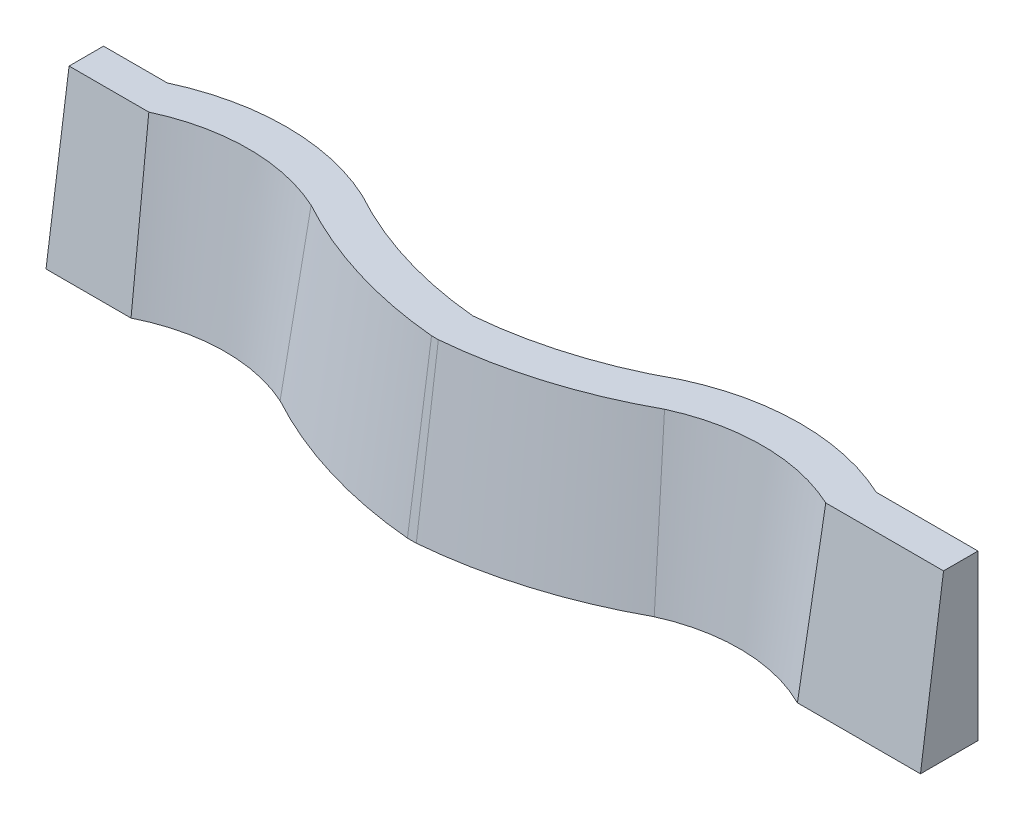
ISO-10303-21;
HEADER;
FILE_DESCRIPTION(('STEP AP214'),'2;1');
FILE_NAME('part.step','',(''),(''),'','','');
FILE_SCHEMA(('AUTOMOTIVE_DESIGN { 1 0 10303 214 1 1 1 1 }'));
ENDSEC;
DATA;
#1=APPLICATION_CONTEXT('core data for automotive mechanical design processes');
#2=APPLICATION_PROTOCOL_DEFINITION('international standard','automotive_design',2000,#1);
#3=PRODUCT_CONTEXT('',#1,'mechanical');
#4=PRODUCT('Part','Part','',(#3));
#5=PRODUCT_RELATED_PRODUCT_CATEGORY('part','',(#4));
#6=PRODUCT_DEFINITION_FORMATION('','',#4);
#7=PRODUCT_DEFINITION_CONTEXT('part definition',#1,'design');
#8=PRODUCT_DEFINITION('design','',#6,#7);
#9=PRODUCT_DEFINITION_SHAPE('','',#8);
#10=(LENGTH_UNIT() NAMED_UNIT(*) SI_UNIT(.MILLI.,.METRE.));
#11=(NAMED_UNIT(*) PLANE_ANGLE_UNIT() SI_UNIT($,.RADIAN.));
#12=(NAMED_UNIT(*) SI_UNIT($,.STERADIAN.) SOLID_ANGLE_UNIT());
#13=UNCERTAINTY_MEASURE_WITH_UNIT(LENGTH_MEASURE(1.E-05),#10,'distance_accuracy_value','');
#14=(GEOMETRIC_REPRESENTATION_CONTEXT(3) GLOBAL_UNCERTAINTY_ASSIGNED_CONTEXT((#13)) GLOBAL_UNIT_ASSIGNED_CONTEXT((#10,
#11,#12)) REPRESENTATION_CONTEXT('',''));
#15=CARTESIAN_POINT('',(0.,0.,0.));
#16=DIRECTION('',(0.,0.,1.));
#17=DIRECTION('',(1.,0.,0.));
#18=AXIS2_PLACEMENT_3D('',#15,#16,#17);
#19=CARTESIAN_POINT('',(67.6062576231202,24.,85.029602130527));
#20=DIRECTION('',(0.,1.,0.));
#21=DIRECTION('',(0.,0.,1.));
#22=AXIS2_PLACEMENT_3D('',#19,#20,#21);
#23=CONICAL_SURFACE('',#22,50.7112727072649,0.139626340159547);
#24=CARTESIAN_POINT('',(49.2028558847586,-19.2,44.3597576684553));
#25=CARTESIAN_POINT('',(48.7507512793166,-12.000003677897,43.453668951004));
#26=CARTESIAN_POINT('',(48.2979035620886,-4.80000551501564,42.5479671954122));
#27=CARTESIAN_POINT('',(47.3907219045216,9.59999448498437,40.7373376088675));
#28=CARTESIAN_POINT('',(46.9363879641841,16.799996322103,39.8324097779139));
#29=CARTESIAN_POINT('',(46.4813109120621,24.,38.927868908819));
#30=B_SPLINE_CURVE_WITH_KNOTS('',3,(#24,#25,#26,#27,#28,#29),.UNSPECIFIED.,.F.,.F.,(4,2,4),(0.,
21.8125666173238,43.6251332124724),.UNSPECIFIED.);
#31=CARTESIAN_POINT('',(49.2028558847586,-19.2,44.3597576684553));
#32=VERTEX_POINT('',#31);
#33=CARTESIAN_POINT('',(46.4813109120623,24.,38.9278689088189));
#34=VERTEX_POINT('',#33);
#35=EDGE_CURVE('E94',#32,#34,#30,.T.);
#36=ORIENTED_EDGE('',*,*,#35,.F.);
#37=CARTESIAN_POINT('',(67.6062576231202,-19.2,85.029602130527));
#38=DIRECTION('',(0.,1.,0.));
#39=DIRECTION('',(0.,0.,1.));
#40=AXIS2_PLACEMENT_3D('',#37,#38,#39);
#41=CIRCLE('',#40,44.6399086481215);
#42=CARTESIAN_POINT('',(87.6358133003991,-19.2,45.1355130510227));
#43=VERTEX_POINT('',#42);
#44=EDGE_CURVE('E51',#32,#43,#41,.F.);
#45=ORIENTED_EDGE('',*,*,#44,.T.);
#46=CARTESIAN_POINT('',(87.6358133003991,-19.2,45.1355130510227));
#47=CARTESIAN_POINT('',(87.7556869922726,-15.6001275997856,44.6295839790745));
#48=CARTESIAN_POINT('',(87.8744888307975,-12.0002202606094,44.1236499967754));
#49=CARTESIAN_POINT('',(88.1100523832755,-4.80034114464104,43.1117729760609));
#50=CARTESIAN_POINT('',(88.2268140978103,-1.20036936786753,42.6058299376481));
#51=CARTESIAN_POINT('',(88.4584010476308,5.99963507905401,41.5939353028168));
#52=CARTESIAN_POINT('',(88.5732262830007,9.59966774919941,41.0879837063987));
#53=CARTESIAN_POINT('',(88.8010316894868,16.7997913698,40.0760723227991));
#54=CARTESIAN_POINT('',(88.9140118600771,20.3998823202715,39.5701125356153));
#55=CARTESIAN_POINT('',(89.0261151704845,24.,39.0641489918794));
#56=B_SPLINE_CURVE_WITH_KNOTS('',3,(#46,#47,#48,#49,#50,#51,#52,#53,#54,#55),.UNSPECIFIED.,.F.,
.F.,(4,2,2,2,4),(0.,10.9116786800797,21.8233542494796,32.7350293447434,43.6467075502935),.UNSPECIFIED.);
#57=CARTESIAN_POINT('',(89.0261151704844,24.,39.0641489918794));
#58=VERTEX_POINT('',#57);
#59=EDGE_CURVE('E124',#43,#58,#56,.T.);
#60=ORIENTED_EDGE('',*,*,#59,.T.);
#61=CARTESIAN_POINT('',(67.6062576231202,24.,85.029602130527));
#62=DIRECTION('',(0.,1.,0.));
#63=DIRECTION('',(0.,0.,1.));
#64=AXIS2_PLACEMENT_3D('',#61,#62,#63);
#65=CIRCLE('',#64,50.7112727072649);
#66=EDGE_CURVE('E99',#58,#34,#65,.T.);
#67=ORIENTED_EDGE('',*,*,#66,.T.);
#68=EDGE_LOOP('',(#36,#45,#60,#67));
#69=FACE_BOUND('',#68,.T.);
#70=ADVANCED_FACE('F41',(#69),#23,.F.);
#71=CARTESIAN_POINT('',(-9.52483016864245,24.,-62.9793470940987));
#72=DIRECTION('',(0.,-1.,0.));
#73=DIRECTION('',(0.,0.,1.));
#74=AXIS2_PLACEMENT_3D('',#71,#72,#73);
#75=CONICAL_SURFACE('',#74,116.283139415038,0.139626340159547);
#76=CARTESIAN_POINT('',(-9.52483016864245,-19.2,-62.9793470940987));
#77=DIRECTION('',(0.,1.,0.));
#78=DIRECTION('',(0.,0.,1.));
#79=AXIS2_PLACEMENT_3D('',#76,#77,#78);
#80=CIRCLE('',#79,122.354503474181);
#81=CARTESIAN_POINT('',(1.16529870736144,-19.2,58.9072627735476));
#82=VERTEX_POINT('',#81);
#83=EDGE_CURVE('E46',#32,#82,#80,.F.);
#84=ORIENTED_EDGE('',*,*,#83,.F.);
#85=ORIENTED_EDGE('',*,*,#35,.T.);
#86=CARTESIAN_POINT('',(-9.52483016864245,24.,-62.9793470940987));
#87=DIRECTION('',(0.,1.,0.));
#88=DIRECTION('',(0.,0.,1.));
#89=AXIS2_PLACEMENT_3D('',#86,#87,#88);
#90=CIRCLE('',#89,116.283139415038);
#91=CARTESIAN_POINT('',(0.896175086760287,24.,52.8358987144043));
#92=VERTEX_POINT('',#91);
#93=EDGE_CURVE('E185',#92,#34,#90,.T.);
#94=ORIENTED_EDGE('',*,*,#93,.F.);
#95=CARTESIAN_POINT('',(1.16529870736144,-19.2,58.9072627735476));
#96=CARTESIAN_POINT('',(1.12101652122196,-11.9999965074305,57.8953682728418));
#97=CARTESIAN_POINT('',(1.07644845976969,-4.79999476128738,56.8834740175801));
#98=CARTESIAN_POINT('',(0.986740586236059,9.60000523871262,54.8596859978657));
#99=CARTESIAN_POINT('',(0.941600774154646,16.8000034925695,53.8477922334129));
#100=CARTESIAN_POINT('',(0.896175086760401,24.,52.8358987144043));
#101=B_SPLINE_CURVE_WITH_KNOTS('',3,(#95,#96,#97,#98,#99,#100),.UNSPECIFIED.,.F.,.F.,(4,2,4),
(0.,21.8126906401658,43.6253812820475),.UNSPECIFIED.);
#102=EDGE_CURVE('E96',#82,#92,#101,.T.);
#103=ORIENTED_EDGE('',*,*,#102,.F.);
#104=EDGE_LOOP('',(#84,#85,#94,#103));
#105=FACE_BOUND('',#104,.T.);
#106=ADVANCED_FACE('F91',(#105),#75,.T.);
#107=CARTESIAN_POINT('',(0.,24.,52.8358987144043));
#108=DIRECTION('',(0.,0.139173100960066,0.99026806874157));
#109=DIRECTION('',(0.,0.99026806874157,-0.139173100960066));
#110=AXIS2_PLACEMENT_3D('',#107,#108,#109);
#111=PLANE('',#110);
#112=DIRECTION('',(-1.,0.,0.));
#113=VECTOR('',#112,1.);
#114=CARTESIAN_POINT('',(0.,-19.2,58.9072627735476));
#115=LINE('',#114,#113);
#116=CARTESIAN_POINT('',(-1.16529870736128,-19.2,58.9072627735476));
#117=VERTEX_POINT('',#116);
#118=EDGE_CURVE('E65',#82,#117,#115,.T.);
#119=ORIENTED_EDGE('',*,*,#118,.F.);
#120=ORIENTED_EDGE('',*,*,#102,.T.);
#121=DIRECTION('',(1.,0.,0.));
#122=VECTOR('',#121,1.);
#123=CARTESIAN_POINT('',(0.,24.,52.8358987144043));
#124=LINE('',#123,#122);
#125=CARTESIAN_POINT('',(-0.896175086760287,24.,52.8358987144043));
#126=VERTEX_POINT('',#125);
#127=EDGE_CURVE('E183',#126,#92,#124,.T.);
#128=ORIENTED_EDGE('',*,*,#127,.F.);
#129=CARTESIAN_POINT('',(-1.16529870736128,-19.2,58.9072627735476));
#130=CARTESIAN_POINT('',(-1.12101652122172,-11.9999965074305,57.8953682728418));
#131=CARTESIAN_POINT('',(-1.07644845976942,-4.79999476128738,56.8834740175801));
#132=CARTESIAN_POINT('',(-0.986740586235836,9.60000523871261,54.8596859978657));
#133=CARTESIAN_POINT('',(-0.941600774154501,16.8000034925695,53.8477922334129));
#134=CARTESIAN_POINT('',(-0.896175086760387,24.,52.8358987144043));
#135=B_SPLINE_CURVE_WITH_KNOTS('',3,(#129,#130,#131,#132,#133,#134),.UNSPECIFIED.,.F.,.F.,(4,2,
4),(0.,21.8126906401658,43.6253812820475),.UNSPECIFIED.);
#136=EDGE_CURVE('E110',#117,#126,#135,.T.);
#137=ORIENTED_EDGE('',*,*,#136,.F.);
#138=EDGE_LOOP('',(#119,#120,#128,#137));
#139=FACE_BOUND('',#138,.T.);
#140=ADVANCED_FACE('F214',(#139),#111,.T.);
#141=CARTESIAN_POINT('',(9.52483016864245,24.,-62.9793470940987));
#142=DIRECTION('',(0.,-1.,0.));
#143=DIRECTION('',(0.,0.,1.));
#144=AXIS2_PLACEMENT_3D('',#141,#142,#143);
#145=CONICAL_SURFACE('',#144,116.283139415038,0.139626340159547);
#146=CARTESIAN_POINT('',(9.52483016864245,-19.2,-62.9793470940987));
#147=DIRECTION('',(0.,1.,0.));
#148=DIRECTION('',(0.,0.,1.));
#149=AXIS2_PLACEMENT_3D('',#146,#147,#148);
#150=CIRCLE('',#149,122.354503474181);
#151=CARTESIAN_POINT('',(-49.2028558847585,-19.2,44.3597576684554));
#152=VERTEX_POINT('',#151);
#153=EDGE_CURVE('E162',#117,#152,#150,.F.);
#154=ORIENTED_EDGE('',*,*,#153,.F.);
#155=ORIENTED_EDGE('',*,*,#136,.T.);
#156=CARTESIAN_POINT('',(9.52483016864245,24.,-62.9793470940987));
#157=DIRECTION('',(0.,1.,0.));
#158=DIRECTION('',(0.,0.,1.));
#159=AXIS2_PLACEMENT_3D('',#156,#157,#158);
#160=CIRCLE('',#159,116.283139415038);
#161=CARTESIAN_POINT('',(-46.4813109120622,24.,38.9278689088189));
#162=VERTEX_POINT('',#161);
#163=EDGE_CURVE('E189',#162,#126,#160,.T.);
#164=ORIENTED_EDGE('',*,*,#163,.F.);
#165=CARTESIAN_POINT('',(-49.2028558847585,-19.2,44.3597576684554));
#166=CARTESIAN_POINT('',(-48.7507512793166,-12.000003677897,43.453668951004));
#167=CARTESIAN_POINT('',(-48.2979035620886,-4.80000551501565,42.5479671954121));
#168=CARTESIAN_POINT('',(-47.3907219045216,9.59999448498436,40.7373376088675));
#169=CARTESIAN_POINT('',(-46.9363879641841,16.799996322103,39.832409777914));
#170=CARTESIAN_POINT('',(-46.4813109120619,24.,38.927868908819));
#171=B_SPLINE_CURVE_WITH_KNOTS('',3,(#165,#166,#167,#168,#169,#170),.UNSPECIFIED.,.F.,.F.,(4,2,
4),(0.,21.8125666173238,43.6251332124724),.UNSPECIFIED.);
#172=EDGE_CURVE('E146',#152,#162,#171,.T.);
#173=ORIENTED_EDGE('',*,*,#172,.F.);
#174=EDGE_LOOP('',(#154,#155,#164,#173));
#175=FACE_BOUND('',#174,.T.);
#176=ADVANCED_FACE('F134',(#175),#145,.T.);
#177=CARTESIAN_POINT('',(-67.6062576231202,24.,85.029602130527));
#178=DIRECTION('',(0.,1.,0.));
#179=DIRECTION('',(0.,0.,1.));
#180=AXIS2_PLACEMENT_3D('',#177,#178,#179);
#181=CONICAL_SURFACE('',#180,50.7112727072649,0.139626340159547);
#182=CARTESIAN_POINT('',(-67.6062576231202,-19.2,85.029602130527));
#183=DIRECTION('',(0.,1.,0.));
#184=DIRECTION('',(0.,0.,1.));
#185=AXIS2_PLACEMENT_3D('',#182,#183,#184);
#186=CIRCLE('',#185,44.6399086481215);
#187=CARTESIAN_POINT('',(-87.6358133003991,-19.2,45.1355130510227));
#188=VERTEX_POINT('',#187);
#189=EDGE_CURVE('E165',#152,#188,#186,.T.);
#190=ORIENTED_EDGE('',*,*,#189,.F.);
#191=ORIENTED_EDGE('',*,*,#172,.T.);
#192=CARTESIAN_POINT('',(-67.6062576231202,24.,85.029602130527));
#193=DIRECTION('',(0.,1.,0.));
#194=DIRECTION('',(0.,0.,1.));
#195=AXIS2_PLACEMENT_3D('',#192,#193,#194);
#196=CIRCLE('',#195,50.7112727072649);
#197=CARTESIAN_POINT('',(-89.0261151704844,24.,39.0641489918794));
#198=VERTEX_POINT('',#197);
#199=EDGE_CURVE('E375',#198,#162,#196,.F.);
#200=ORIENTED_EDGE('',*,*,#199,.F.);
#201=CARTESIAN_POINT('',(-87.6358133003991,-19.2,45.1355130510227));
#202=CARTESIAN_POINT('',(-87.7556869922726,-15.6001275997856,44.6295839790745));
#203=CARTESIAN_POINT('',(-87.8744888307975,-12.0002202606094,44.1236499967754));
#204=CARTESIAN_POINT('',(-88.1100523832755,-4.80034114464104,43.1117729760609));
#205=CARTESIAN_POINT('',(-88.2268140978103,-1.20036936786754,42.6058299376481));
#206=CARTESIAN_POINT('',(-88.4584010476308,5.99963507905401,41.5939353028168));
#207=CARTESIAN_POINT('',(-88.5732262830007,9.5996677491994,41.0879837063987));
#208=CARTESIAN_POINT('',(-88.8010316894868,16.7997913698,40.0760723227991));
#209=CARTESIAN_POINT('',(-88.9140118600771,20.3998823202715,39.5701125356153));
#210=CARTESIAN_POINT('',(-89.0261151704845,24.,39.0641489918794));
#211=B_SPLINE_CURVE_WITH_KNOTS('',3,(#201,#202,#203,#204,#205,#206,#207,#208,#209,#210),
.UNSPECIFIED.,.F.,.F.,(4,2,2,2,4),(0.,10.9116786800797,21.8233542494796,32.7350293447434,
43.6467075502935),.UNSPECIFIED.);
#212=EDGE_CURVE('E154',#188,#198,#211,.T.);
#213=ORIENTED_EDGE('',*,*,#212,.F.);
#214=EDGE_LOOP('',(#190,#191,#200,#213));
#215=FACE_BOUND('',#214,.T.);
#216=ADVANCED_FACE('F145',(#215),#181,.F.);
#217=CARTESIAN_POINT('',(0.,24.,39.0641489918794));
#218=DIRECTION('',(0.,0.139173100960066,0.99026806874157));
#219=DIRECTION('',(0.,0.99026806874157,-0.139173100960066));
#220=AXIS2_PLACEMENT_3D('',#217,#218,#219);
#221=PLANE('',#220);
#222=DIRECTION('',(-1.,0.,0.));
#223=VECTOR('',#222,1.);
#224=CARTESIAN_POINT('',(0.,-19.2,45.1355130510227));
#225=LINE('',#224,#223);
#226=CARTESIAN_POINT('',(-110.,-19.2,45.1355130510227));
#227=VERTEX_POINT('',#226);
#228=EDGE_CURVE('E168',#188,#227,#225,.T.);
#229=ORIENTED_EDGE('',*,*,#228,.F.);
#230=ORIENTED_EDGE('',*,*,#212,.T.);
#231=DIRECTION('',(1.,0.,0.));
#232=VECTOR('',#231,1.);
#233=CARTESIAN_POINT('',(0.,24.,39.0641489918794));
#234=LINE('',#233,#232);
#235=CARTESIAN_POINT('',(-110.,24.,39.0641489918794));
#236=VERTEX_POINT('',#235);
#237=EDGE_CURVE('E380',#236,#198,#234,.T.);
#238=ORIENTED_EDGE('',*,*,#237,.F.);
#239=DIRECTION('',(0.,0.99026806874157,-0.139173100960066));
#240=VECTOR('',#239,1.);
#241=CARTESIAN_POINT('',(-110.,-240.251660973629,76.2022979966067));
#242=LINE('',#241,#240);
#243=EDGE_CURVE('E159',#227,#236,#242,.T.);
#244=ORIENTED_EDGE('',*,*,#243,.F.);
#245=EDGE_LOOP('',(#229,#230,#238,#244));
#246=FACE_BOUND('',#245,.T.);
#247=ADVANCED_FACE('F43',(#246),#221,.T.);
#248=CARTESIAN_POINT('',(-110.,-250.961195540313,0.));
#249=DIRECTION('',(-1.,0.,0.));
#250=DIRECTION('',(0.,0.,1.));
#251=AXIS2_PLACEMENT_3D('',#248,#249,#250);
#252=PLANE('',#251);
#253=DIRECTION('',(0.,0.,-1.));
#254=VECTOR('',#253,1.);
#255=CARTESIAN_POINT('',(-110.,-19.2,0.));
#256=LINE('',#255,#254);
#257=CARTESIAN_POINT('',(-110.,-19.2,30.));
#258=VERTEX_POINT('',#257);
#259=EDGE_CURVE('E166',#227,#258,#256,.T.);
#260=ORIENTED_EDGE('',*,*,#259,.F.);
#261=ORIENTED_EDGE('',*,*,#243,.T.);
#262=DIRECTION('',(0.,0.,1.));
#263=VECTOR('',#262,1.);
#264=CARTESIAN_POINT('',(-110.,24.,0.));
#265=LINE('',#264,#263);
#266=CARTESIAN_POINT('',(-110.,24.,30.));
#267=VERTEX_POINT('',#266);
#268=EDGE_CURVE('E378',#267,#236,#265,.T.);
#269=ORIENTED_EDGE('',*,*,#268,.F.);
#270=DIRECTION('',(0.,1.,0.));
#271=VECTOR('',#270,1.);
#272=CARTESIAN_POINT('',(-110.,-250.961195540313,30.));
#273=LINE('',#272,#271);
#274=EDGE_CURVE('E171',#258,#267,#273,.T.);
#275=ORIENTED_EDGE('',*,*,#274,.F.);
#276=EDGE_LOOP('',(#260,#261,#269,#275));
#277=FACE_BOUND('',#276,.T.);
#278=ADVANCED_FACE('F243',(#277),#252,.T.);
#279=CARTESIAN_POINT('',(0.,-250.961195540313,30.));
#280=DIRECTION('',(0.,0.,1.));
#281=DIRECTION('',(1.,0.,0.));
#282=AXIS2_PLACEMENT_3D('',#279,#280,#281);
#283=PLANE('',#282);
#284=DIRECTION('',(0.,1.,0.));
#285=VECTOR('',#284,1.);
#286=CARTESIAN_POINT('',(-93.25,-250.961195540313,30.));
#287=LINE('',#286,#285);
#288=CARTESIAN_POINT('',(-93.25,-19.2,30.));
#289=VERTEX_POINT('',#288);
#290=CARTESIAN_POINT('',(-93.25,24.,30.));
#291=VERTEX_POINT('',#290);
#292=EDGE_CURVE('E193',#289,#291,#287,.T.);
#293=ORIENTED_EDGE('',*,*,#292,.F.);
#294=DIRECTION('',(-1.,0.,0.));
#295=VECTOR('',#294,1.);
#296=CARTESIAN_POINT('',(0.,-19.2,30.));
#297=LINE('',#296,#295);
#298=EDGE_CURVE('E408',#289,#258,#297,.T.);
#299=ORIENTED_EDGE('',*,*,#298,.T.);
#300=ORIENTED_EDGE('',*,*,#274,.T.);
#301=DIRECTION('',(1.,0.,0.));
#302=VECTOR('',#301,1.);
#303=CARTESIAN_POINT('',(0.,24.,30.));
#304=LINE('',#303,#302);
#305=EDGE_CURVE('E384',#267,#291,#304,.T.);
#306=ORIENTED_EDGE('',*,*,#305,.T.);
#307=EDGE_LOOP('',(#293,#299,#300,#306));
#308=FACE_BOUND('',#307,.T.);
#309=ADVANCED_FACE('F237',(#308),#283,.F.);
#310=CARTESIAN_POINT('',(-67.6062576231202,-250.961195540313,85.029602130527));
#311=DIRECTION('',(0.,1.,0.));
#312=DIRECTION('',(0.,0.,1.));
#313=AXIS2_PLACEMENT_3D('',#310,#311,#312);
#314=CYLINDRICAL_SURFACE('',#313,60.7112727072649);
#315=DIRECTION('',(0.,1.,0.));
#316=VECTOR('',#315,1.);
#317=CARTESIAN_POINT('',(-41.9625152462405,-250.961195540313,30.));
#318=LINE('',#317,#316);
#319=CARTESIAN_POINT('',(-41.9625152462405,-19.2,30.));
#320=VERTEX_POINT('',#319);
#321=CARTESIAN_POINT('',(-41.9625152462405,24.,30.));
#322=VERTEX_POINT('',#321);
#323=EDGE_CURVE('E200',#320,#322,#318,.T.);
#324=ORIENTED_EDGE('',*,*,#323,.F.);
#325=CARTESIAN_POINT('',(-67.6062576231202,-19.2,85.029602130527));
#326=DIRECTION('',(0.,1.,0.));
#327=DIRECTION('',(0.,0.,1.));
#328=AXIS2_PLACEMENT_3D('',#325,#326,#327);
#329=CIRCLE('',#328,60.7112727072649);
#330=EDGE_CURVE('E415',#320,#289,#329,.T.);
#331=ORIENTED_EDGE('',*,*,#330,.T.);
#332=ORIENTED_EDGE('',*,*,#292,.T.);
#333=CARTESIAN_POINT('',(-67.6062576231202,24.,85.029602130527));
#334=DIRECTION('',(0.,1.,0.));
#335=DIRECTION('',(0.,0.,1.));
#336=AXIS2_PLACEMENT_3D('',#333,#334,#335);
#337=CIRCLE('',#336,60.7112727072649);
#338=EDGE_CURVE('E389',#291,#322,#337,.F.);
#339=ORIENTED_EDGE('',*,*,#338,.T.);
#340=EDGE_LOOP('',(#324,#331,#332,#339));
#341=FACE_BOUND('',#340,.T.);
#342=ADVANCED_FACE('F232',(#341),#314,.T.);
#343=CARTESIAN_POINT('',(9.52483016864245,-250.961195540313,-62.9793470940987));
#344=DIRECTION('',(0.,1.,0.));
#345=DIRECTION('',(0.,0.,1.));
#346=AXIS2_PLACEMENT_3D('',#343,#344,#345);
#347=CYLINDRICAL_SURFACE('',#346,106.283139415038);
#348=DIRECTION('',(0.,1.,0.));
#349=VECTOR('',#348,1.);
#350=CARTESIAN_POINT('',(0.,-250.961195540313,42.8761361562973));
#351=LINE('',#350,#349);
#352=CARTESIAN_POINT('',(0.,-19.2,42.8761361562973));
#353=VERTEX_POINT('',#352);
#354=CARTESIAN_POINT('',(0.,24.,42.8761361562973));
#355=VERTEX_POINT('',#354);
#356=EDGE_CURVE('E198',#353,#355,#351,.T.);
#357=ORIENTED_EDGE('',*,*,#356,.F.);
#358=CARTESIAN_POINT('',(9.52483016864245,-19.2,-62.9793470940987));
#359=DIRECTION('',(0.,1.,0.));
#360=DIRECTION('',(0.,0.,1.));
#361=AXIS2_PLACEMENT_3D('',#358,#359,#360);
#362=CIRCLE('',#361,106.283139415038);
#363=EDGE_CURVE('E413',#353,#320,#362,.F.);
#364=ORIENTED_EDGE('',*,*,#363,.T.);
#365=ORIENTED_EDGE('',*,*,#323,.T.);
#366=CARTESIAN_POINT('',(9.52483016864245,24.,-62.9793470940987));
#367=DIRECTION('',(0.,1.,0.));
#368=DIRECTION('',(0.,0.,1.));
#369=AXIS2_PLACEMENT_3D('',#366,#367,#368);
#370=CIRCLE('',#369,106.283139415038);
#371=EDGE_CURVE('E388',#322,#355,#370,.T.);
#372=ORIENTED_EDGE('',*,*,#371,.T.);
#373=EDGE_LOOP('',(#357,#364,#365,#372));
#374=FACE_BOUND('',#373,.T.);
#375=ADVANCED_FACE('F233',(#374),#347,.F.);
#376=CARTESIAN_POINT('',(-9.52483016864245,-250.961195540313,-62.9793470940987));
#377=DIRECTION('',(0.,1.,0.));
#378=DIRECTION('',(0.,0.,1.));
#379=AXIS2_PLACEMENT_3D('',#376,#377,#378);
#380=CYLINDRICAL_SURFACE('',#379,106.283139415038);
#381=DIRECTION('',(0.,1.,0.));
#382=VECTOR('',#381,1.);
#383=CARTESIAN_POINT('',(41.9625152462405,-250.961195540313,30.));
#384=LINE('',#383,#382);
#385=CARTESIAN_POINT('',(41.9625152462405,-19.2,30.));
#386=VERTEX_POINT('',#385);
#387=CARTESIAN_POINT('',(41.9625152462405,24.,30.));
#388=VERTEX_POINT('',#387);
#389=EDGE_CURVE('E201',#386,#388,#384,.T.);
#390=ORIENTED_EDGE('',*,*,#389,.F.);
#391=CARTESIAN_POINT('',(-9.52483016864245,-19.2,-62.9793470940987));
#392=DIRECTION('',(0.,1.,0.));
#393=DIRECTION('',(0.,0.,1.));
#394=AXIS2_PLACEMENT_3D('',#391,#392,#393);
#395=CIRCLE('',#394,106.283139415038);
#396=EDGE_CURVE('E416',#386,#353,#395,.F.);
#397=ORIENTED_EDGE('',*,*,#396,.T.);
#398=ORIENTED_EDGE('',*,*,#356,.T.);
#399=CARTESIAN_POINT('',(-9.52483016864245,24.,-62.9793470940987));
#400=DIRECTION('',(0.,1.,0.));
#401=DIRECTION('',(0.,0.,1.));
#402=AXIS2_PLACEMENT_3D('',#399,#400,#401);
#403=CIRCLE('',#402,106.283139415038);
#404=EDGE_CURVE('E395',#355,#388,#403,.T.);
#405=ORIENTED_EDGE('',*,*,#404,.T.);
#406=EDGE_LOOP('',(#390,#397,#398,#405));
#407=FACE_BOUND('',#406,.T.);
#408=ADVANCED_FACE('F227',(#407),#380,.F.);
#409=CARTESIAN_POINT('',(67.6062576231202,-250.961195540313,85.029602130527));
#410=DIRECTION('',(0.,1.,0.));
#411=DIRECTION('',(0.,0.,1.));
#412=AXIS2_PLACEMENT_3D('',#409,#410,#411);
#413=CYLINDRICAL_SURFACE('',#412,60.7112727072649);
#414=CARTESIAN_POINT('',(67.6062576231202,-19.2,85.029602130527));
#415=DIRECTION('',(0.,1.,0.));
#416=DIRECTION('',(0.,0.,1.));
#417=AXIS2_PLACEMENT_3D('',#414,#415,#416);
#418=CIRCLE('',#417,60.7112727072649);
#419=CARTESIAN_POINT('',(93.25,-19.2,30.));
#420=VERTEX_POINT('',#419);
#421=EDGE_CURVE('E423',#386,#420,#418,.F.);
#422=ORIENTED_EDGE('',*,*,#421,.F.);
#423=ORIENTED_EDGE('',*,*,#389,.T.);
#424=CARTESIAN_POINT('',(67.6062576231202,24.,85.029602130527));
#425=DIRECTION('',(0.,1.,0.));
#426=DIRECTION('',(0.,0.,1.));
#427=AXIS2_PLACEMENT_3D('',#424,#425,#426);
#428=CIRCLE('',#427,60.7112727072649);
#429=CARTESIAN_POINT('',(93.25,24.,30.));
#430=VERTEX_POINT('',#429);
#431=EDGE_CURVE('E393',#430,#388,#428,.T.);
#432=ORIENTED_EDGE('',*,*,#431,.F.);
#433=DIRECTION('',(0.,1.,0.));
#434=VECTOR('',#433,1.);
#435=CARTESIAN_POINT('',(93.25,-250.961195540313,30.));
#436=LINE('',#435,#434);
#437=EDGE_CURVE('E179',#420,#430,#436,.T.);
#438=ORIENTED_EDGE('',*,*,#437,.F.);
#439=EDGE_LOOP('',(#422,#423,#432,#438));
#440=FACE_BOUND('',#439,.T.);
#441=ADVANCED_FACE('F221',(#440),#413,.T.);
#442=CARTESIAN_POINT('',(0.,-250.961195540313,30.));
#443=DIRECTION('',(0.,0.,1.));
#444=DIRECTION('',(1.,0.,0.));
#445=AXIS2_PLACEMENT_3D('',#442,#443,#444);
#446=PLANE('',#445);
#447=DIRECTION('',(0.,1.,0.));
#448=VECTOR('',#447,1.);
#449=CARTESIAN_POINT('',(120.,-250.961195540313,30.));
#450=LINE('',#449,#448);
#451=CARTESIAN_POINT('',(120.,-19.2,30.));
#452=VERTEX_POINT('',#451);
#453=CARTESIAN_POINT('',(120.,24.,30.));
#454=VERTEX_POINT('',#453);
#455=EDGE_CURVE('E172',#452,#454,#450,.T.);
#456=ORIENTED_EDGE('',*,*,#455,.F.);
#457=DIRECTION('',(-1.,0.,0.));
#458=VECTOR('',#457,1.);
#459=CARTESIAN_POINT('',(0.,-19.2,30.));
#460=LINE('',#459,#458);
#461=EDGE_CURVE('E102',#452,#420,#460,.T.);
#462=ORIENTED_EDGE('',*,*,#461,.T.);
#463=ORIENTED_EDGE('',*,*,#437,.T.);
#464=DIRECTION('',(1.,0.,0.));
#465=VECTOR('',#464,1.);
#466=CARTESIAN_POINT('',(0.,24.,30.));
#467=LINE('',#466,#465);
#468=EDGE_CURVE('E396',#430,#454,#467,.T.);
#469=ORIENTED_EDGE('',*,*,#468,.T.);
#470=EDGE_LOOP('',(#456,#462,#463,#469));
#471=FACE_BOUND('',#470,.T.);
#472=ADVANCED_FACE('F216',(#471),#446,.F.);
#473=CARTESIAN_POINT('',(120.,-250.961195540313,0.));
#474=DIRECTION('',(-1.,0.,0.));
#475=DIRECTION('',(0.,0.,1.));
#476=AXIS2_PLACEMENT_3D('',#473,#474,#475);
#477=PLANE('',#476);
#478=DIRECTION('',(0.,0.99026806874157,-0.139173100960066));
#479=VECTOR('',#478,1.);
#480=CARTESIAN_POINT('',(120.,-240.251660973629,76.2022979966067));
#481=LINE('',#480,#479);
#482=CARTESIAN_POINT('',(120.,-19.2,45.1355130510227));
#483=VERTEX_POINT('',#482);
#484=CARTESIAN_POINT('',(120.,24.,39.0641489918794));
#485=VERTEX_POINT('',#484);
#486=EDGE_CURVE('E175',#483,#485,#481,.T.);
#487=ORIENTED_EDGE('',*,*,#486,.F.);
#488=DIRECTION('',(0.,0.,-1.));
#489=VECTOR('',#488,1.);
#490=CARTESIAN_POINT('',(120.,-19.2,0.));
#491=LINE('',#490,#489);
#492=EDGE_CURVE('E105',#483,#452,#491,.T.);
#493=ORIENTED_EDGE('',*,*,#492,.T.);
#494=ORIENTED_EDGE('',*,*,#455,.T.);
#495=DIRECTION('',(0.,0.,1.));
#496=VECTOR('',#495,1.);
#497=CARTESIAN_POINT('',(120.,24.,0.));
#498=LINE('',#497,#496);
#499=EDGE_CURVE('E402',#454,#485,#498,.T.);
#500=ORIENTED_EDGE('',*,*,#499,.T.);
#501=EDGE_LOOP('',(#487,#493,#494,#500));
#502=FACE_BOUND('',#501,.T.);
#503=ADVANCED_FACE('F139',(#502),#477,.F.);
#504=CARTESIAN_POINT('',(0.,24.,39.0641489918795));
#505=DIRECTION('',(0.,0.139173100960066,0.99026806874157));
#506=DIRECTION('',(0.,0.99026806874157,-0.139173100960066));
#507=AXIS2_PLACEMENT_3D('',#504,#505,#506);
#508=PLANE('',#507);
#509=DIRECTION('',(-1.,0.,0.));
#510=VECTOR('',#509,1.);
#511=CARTESIAN_POINT('',(0.,-19.2,45.1355130510228));
#512=LINE('',#511,#510);
#513=EDGE_CURVE('E11',#483,#43,#512,.T.);
#514=ORIENTED_EDGE('',*,*,#513,.F.);
#515=ORIENTED_EDGE('',*,*,#486,.T.);
#516=DIRECTION('',(1.,0.,0.));
#517=VECTOR('',#516,1.);
#518=CARTESIAN_POINT('',(0.,24.,39.0641489918795));
#519=LINE('',#518,#517);
#520=EDGE_CURVE('E401',#58,#485,#519,.T.);
#521=ORIENTED_EDGE('',*,*,#520,.F.);
#522=ORIENTED_EDGE('',*,*,#59,.F.);
#523=EDGE_LOOP('',(#514,#515,#521,#522));
#524=FACE_BOUND('',#523,.T.);
#525=ADVANCED_FACE('F133',(#524),#508,.T.);
#526=CARTESIAN_POINT('',(0.,24.,0.));
#527=DIRECTION('',(0.,1.,0.));
#528=DIRECTION('',(0.,0.,1.));
#529=AXIS2_PLACEMENT_3D('',#526,#527,#528);
#530=PLANE('',#529);
#531=ORIENTED_EDGE('',*,*,#66,.F.);
#532=ORIENTED_EDGE('',*,*,#520,.T.);
#533=ORIENTED_EDGE('',*,*,#499,.F.);
#534=ORIENTED_EDGE('',*,*,#468,.F.);
#535=ORIENTED_EDGE('',*,*,#431,.T.);
#536=ORIENTED_EDGE('',*,*,#404,.F.);
#537=ORIENTED_EDGE('',*,*,#371,.F.);
#538=ORIENTED_EDGE('',*,*,#338,.F.);
#539=ORIENTED_EDGE('',*,*,#305,.F.);
#540=ORIENTED_EDGE('',*,*,#268,.T.);
#541=ORIENTED_EDGE('',*,*,#237,.T.);
#542=ORIENTED_EDGE('',*,*,#199,.T.);
#543=ORIENTED_EDGE('',*,*,#163,.T.);
#544=ORIENTED_EDGE('',*,*,#127,.T.);
#545=ORIENTED_EDGE('',*,*,#93,.T.);
#546=EDGE_LOOP('',(#531,#532,#533,#534,#535,#536,#537,#538,#539,#540,#541,#542,#543,#544,#545));
#547=FACE_BOUND('',#546,.T.);
#548=ADVANCED_FACE('F137',(#547),#530,.T.);
#549=CARTESIAN_POINT('',(0.,-19.2,0.));
#550=DIRECTION('',(0.,1.,0.));
#551=DIRECTION('',(0.,0.,1.));
#552=AXIS2_PLACEMENT_3D('',#549,#550,#551);
#553=PLANE('',#552);
#554=ORIENTED_EDGE('',*,*,#83,.T.);
#555=ORIENTED_EDGE('',*,*,#118,.T.);
#556=ORIENTED_EDGE('',*,*,#153,.T.);
#557=ORIENTED_EDGE('',*,*,#189,.T.);
#558=ORIENTED_EDGE('',*,*,#228,.T.);
#559=ORIENTED_EDGE('',*,*,#259,.T.);
#560=ORIENTED_EDGE('',*,*,#298,.F.);
#561=ORIENTED_EDGE('',*,*,#330,.F.);
#562=ORIENTED_EDGE('',*,*,#363,.F.);
#563=ORIENTED_EDGE('',*,*,#396,.F.);
#564=ORIENTED_EDGE('',*,*,#421,.T.);
#565=ORIENTED_EDGE('',*,*,#461,.F.);
#566=ORIENTED_EDGE('',*,*,#492,.F.);
#567=ORIENTED_EDGE('',*,*,#513,.T.);
#568=ORIENTED_EDGE('',*,*,#44,.F.);
#569=EDGE_LOOP('',(#554,#555,#556,#557,#558,#559,#560,#561,#562,#563,#564,#565,#566,#567,#568));
#570=FACE_BOUND('',#569,.T.);
#571=ADVANCED_FACE('F83',(#570),#553,.F.);
#572=CLOSED_SHELL('',(#70,#106,#140,#176,#216,#247,#278,#309,#342,#375,#408,#441,#472,#503,#525,
#548,#571));
#573=MANIFOLD_SOLID_BREP('B2',#572);
#574=ADVANCED_BREP_SHAPE_REPRESENTATION('',(#18,#573),#14);
#575=SHAPE_DEFINITION_REPRESENTATION(#9,#574);
ENDSEC;
END-ISO-10303-21;
